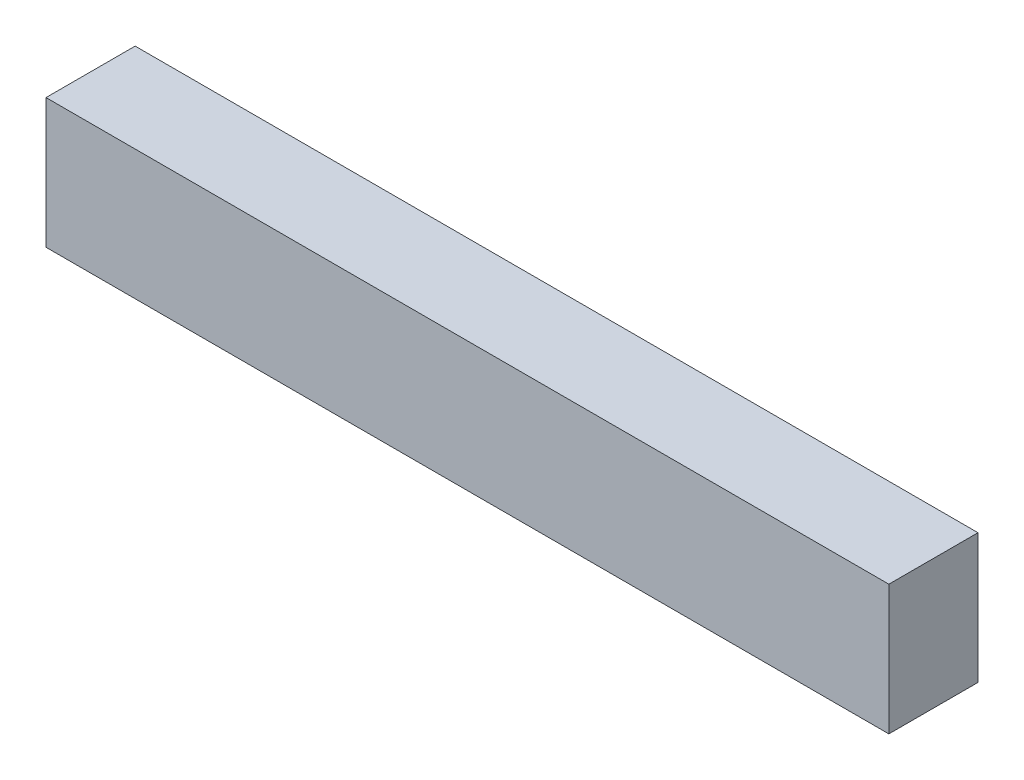
ISO-10303-21;
HEADER;
FILE_DESCRIPTION(('STEP AP214'),'2;1');
FILE_NAME('part.step','',(''),(''),'','','');
FILE_SCHEMA(('AUTOMOTIVE_DESIGN { 1 0 10303 214 1 1 1 1 }'));
ENDSEC;
DATA;
#1=APPLICATION_CONTEXT('core data for automotive mechanical design processes');
#2=APPLICATION_PROTOCOL_DEFINITION('international standard','automotive_design',2000,#1);
#3=PRODUCT_CONTEXT('',#1,'mechanical');
#4=PRODUCT('Part','Part','',(#3));
#5=PRODUCT_RELATED_PRODUCT_CATEGORY('part','',(#4));
#6=PRODUCT_DEFINITION_FORMATION('','',#4);
#7=PRODUCT_DEFINITION_CONTEXT('part definition',#1,'design');
#8=PRODUCT_DEFINITION('design','',#6,#7);
#9=PRODUCT_DEFINITION_SHAPE('','',#8);
#10=(LENGTH_UNIT() NAMED_UNIT(*) SI_UNIT(.MILLI.,.METRE.));
#11=(NAMED_UNIT(*) PLANE_ANGLE_UNIT() SI_UNIT($,.RADIAN.));
#12=(NAMED_UNIT(*) SI_UNIT($,.STERADIAN.) SOLID_ANGLE_UNIT());
#13=UNCERTAINTY_MEASURE_WITH_UNIT(LENGTH_MEASURE(1.E-05),#10,'distance_accuracy_value','');
#14=(GEOMETRIC_REPRESENTATION_CONTEXT(3) GLOBAL_UNCERTAINTY_ASSIGNED_CONTEXT((#13)) GLOBAL_UNIT_ASSIGNED_CONTEXT((#10,
#11,#12)) REPRESENTATION_CONTEXT('',''));
#15=CARTESIAN_POINT('',(0.,0.,0.));
#16=DIRECTION('',(0.,0.,1.));
#17=DIRECTION('',(1.,0.,0.));
#18=AXIS2_PLACEMENT_3D('',#15,#16,#17);
#19=CARTESIAN_POINT('',(260.,-40.,55.));
#20=DIRECTION('',(-1.,0.,0.));
#21=DIRECTION('',(0.,0.,1.));
#22=AXIS2_PLACEMENT_3D('',#19,#20,#21);
#23=PLANE('',#22);
#24=DIRECTION('',(0.,1.,0.));
#25=VECTOR('',#24,1.);
#26=CARTESIAN_POINT('',(260.,-40.,0.));
#27=LINE('',#26,#25);
#28=CARTESIAN_POINT('',(260.,-40.,0.));
#29=VERTEX_POINT('',#28);
#30=CARTESIAN_POINT('',(260.,40.,0.));
#31=VERTEX_POINT('',#30);
#32=EDGE_CURVE('E113',#29,#31,#27,.T.);
#33=ORIENTED_EDGE('',*,*,#32,.T.);
#34=DIRECTION('',(0.,0.,-1.));
#35=VECTOR('',#34,1.);
#36=CARTESIAN_POINT('',(260.,40.,55.));
#37=LINE('',#36,#35);
#38=CARTESIAN_POINT('',(260.,40.,55.));
#39=VERTEX_POINT('',#38);
#40=EDGE_CURVE('E11',#39,#31,#37,.T.);
#41=ORIENTED_EDGE('',*,*,#40,.F.);
#42=DIRECTION('',(0.,1.,0.));
#43=VECTOR('',#42,1.);
#44=CARTESIAN_POINT('',(260.,-40.,55.));
#45=LINE('',#44,#43);
#46=CARTESIAN_POINT('',(260.,-40.,55.));
#47=VERTEX_POINT('',#46);
#48=EDGE_CURVE('E97',#47,#39,#45,.T.);
#49=ORIENTED_EDGE('',*,*,#48,.F.);
#50=DIRECTION('',(0.,0.,-1.));
#51=VECTOR('',#50,1.);
#52=CARTESIAN_POINT('',(260.,-40.,55.));
#53=LINE('',#52,#51);
#54=EDGE_CURVE('E109',#47,#29,#53,.T.);
#55=ORIENTED_EDGE('',*,*,#54,.T.);
#56=EDGE_LOOP('',(#33,#41,#49,#55));
#57=FACE_BOUND('',#56,.T.);
#58=ADVANCED_FACE('F45',(#57),#23,.F.);
#59=CARTESIAN_POINT('',(-260.,40.,55.));
#60=DIRECTION('',(0.,-1.,0.));
#61=DIRECTION('',(0.,0.,-1.));
#62=AXIS2_PLACEMENT_3D('',#59,#60,#61);
#63=PLANE('',#62);
#64=DIRECTION('',(-1.,0.,0.));
#65=VECTOR('',#64,1.);
#66=CARTESIAN_POINT('',(-260.,40.,0.));
#67=LINE('',#66,#65);
#68=CARTESIAN_POINT('',(-260.,40.,0.));
#69=VERTEX_POINT('',#68);
#70=EDGE_CURVE('E102',#31,#69,#67,.T.);
#71=ORIENTED_EDGE('',*,*,#70,.T.);
#72=DIRECTION('',(0.,0.,-1.));
#73=VECTOR('',#72,1.);
#74=CARTESIAN_POINT('',(-260.,40.,55.));
#75=LINE('',#74,#73);
#76=CARTESIAN_POINT('',(-260.,40.,55.));
#77=VERTEX_POINT('',#76);
#78=EDGE_CURVE('E54',#77,#69,#75,.T.);
#79=ORIENTED_EDGE('',*,*,#78,.F.);
#80=DIRECTION('',(-1.,0.,0.));
#81=VECTOR('',#80,1.);
#82=CARTESIAN_POINT('',(-260.,40.,55.));
#83=LINE('',#82,#81);
#84=EDGE_CURVE('E92',#39,#77,#83,.T.);
#85=ORIENTED_EDGE('',*,*,#84,.F.);
#86=ORIENTED_EDGE('',*,*,#40,.T.);
#87=EDGE_LOOP('',(#71,#79,#85,#86));
#88=FACE_BOUND('',#87,.T.);
#89=ADVANCED_FACE('F101',(#88),#63,.F.);
#90=CARTESIAN_POINT('',(-260.,-40.,55.));
#91=DIRECTION('',(1.,0.,0.));
#92=DIRECTION('',(0.,0.,-1.));
#93=AXIS2_PLACEMENT_3D('',#90,#91,#92);
#94=PLANE('',#93);
#95=DIRECTION('',(0.,-1.,0.));
#96=VECTOR('',#95,1.);
#97=CARTESIAN_POINT('',(-260.,-40.,0.));
#98=LINE('',#97,#96);
#99=CARTESIAN_POINT('',(-260.,-40.,0.));
#100=VERTEX_POINT('',#99);
#101=EDGE_CURVE('E79',#69,#100,#98,.T.);
#102=ORIENTED_EDGE('',*,*,#101,.T.);
#103=DIRECTION('',(0.,0.,-1.));
#104=VECTOR('',#103,1.);
#105=CARTESIAN_POINT('',(-260.,-40.,55.));
#106=LINE('',#105,#104);
#107=CARTESIAN_POINT('',(-260.,-40.,55.));
#108=VERTEX_POINT('',#107);
#109=EDGE_CURVE('E104',#108,#100,#106,.T.);
#110=ORIENTED_EDGE('',*,*,#109,.F.);
#111=DIRECTION('',(0.,-1.,0.));
#112=VECTOR('',#111,1.);
#113=CARTESIAN_POINT('',(-260.,-40.,55.));
#114=LINE('',#113,#112);
#115=EDGE_CURVE('E95',#77,#108,#114,.T.);
#116=ORIENTED_EDGE('',*,*,#115,.F.);
#117=ORIENTED_EDGE('',*,*,#78,.T.);
#118=EDGE_LOOP('',(#102,#110,#116,#117));
#119=FACE_BOUND('',#118,.T.);
#120=ADVANCED_FACE('F105',(#119),#94,.F.);
#121=CARTESIAN_POINT('',(-260.,-40.,55.));
#122=DIRECTION('',(0.,1.,0.));
#123=DIRECTION('',(0.,0.,1.));
#124=AXIS2_PLACEMENT_3D('',#121,#122,#123);
#125=PLANE('',#124);
#126=DIRECTION('',(1.,0.,0.));
#127=VECTOR('',#126,1.);
#128=CARTESIAN_POINT('',(-260.,-40.,0.));
#129=LINE('',#128,#127);
#130=EDGE_CURVE('E85',#100,#29,#129,.T.);
#131=ORIENTED_EDGE('',*,*,#130,.T.);
#132=ORIENTED_EDGE('',*,*,#54,.F.);
#133=DIRECTION('',(1.,0.,0.));
#134=VECTOR('',#133,1.);
#135=CARTESIAN_POINT('',(-260.,-40.,55.));
#136=LINE('',#135,#134);
#137=EDGE_CURVE('E62',#108,#47,#136,.T.);
#138=ORIENTED_EDGE('',*,*,#137,.F.);
#139=ORIENTED_EDGE('',*,*,#109,.T.);
#140=EDGE_LOOP('',(#131,#132,#138,#139));
#141=FACE_BOUND('',#140,.T.);
#142=ADVANCED_FACE('F126',(#141),#125,.F.);
#143=CARTESIAN_POINT('',(0.,0.,55.));
#144=DIRECTION('',(0.,0.,-1.));
#145=DIRECTION('',(-1.,0.,0.));
#146=AXIS2_PLACEMENT_3D('',#143,#144,#145);
#147=PLANE('',#146);
#148=ORIENTED_EDGE('',*,*,#48,.T.);
#149=ORIENTED_EDGE('',*,*,#84,.T.);
#150=ORIENTED_EDGE('',*,*,#115,.T.);
#151=ORIENTED_EDGE('',*,*,#137,.T.);
#152=EDGE_LOOP('',(#148,#149,#150,#151));
#153=FACE_BOUND('',#152,.T.);
#154=ADVANCED_FACE('F93',(#153),#147,.F.);
#155=CARTESIAN_POINT('',(0.,0.,0.));
#156=DIRECTION('',(0.,0.,-1.));
#157=DIRECTION('',(-1.,0.,0.));
#158=AXIS2_PLACEMENT_3D('',#155,#156,#157);
#159=PLANE('',#158);
#160=ORIENTED_EDGE('',*,*,#32,.F.);
#161=ORIENTED_EDGE('',*,*,#130,.F.);
#162=ORIENTED_EDGE('',*,*,#101,.F.);
#163=ORIENTED_EDGE('',*,*,#70,.F.);
#164=EDGE_LOOP('',(#160,#161,#162,#163));
#165=FACE_BOUND('',#164,.T.);
#166=ADVANCED_FACE('F129',(#165),#159,.T.);
#167=CLOSED_SHELL('',(#58,#89,#120,#142,#154,#166));
#168=MANIFOLD_SOLID_BREP('B2',#167);
#169=ADVANCED_BREP_SHAPE_REPRESENTATION('',(#18,#168),#14);
#170=SHAPE_DEFINITION_REPRESENTATION(#9,#169);
ENDSEC;
END-ISO-10303-21;
